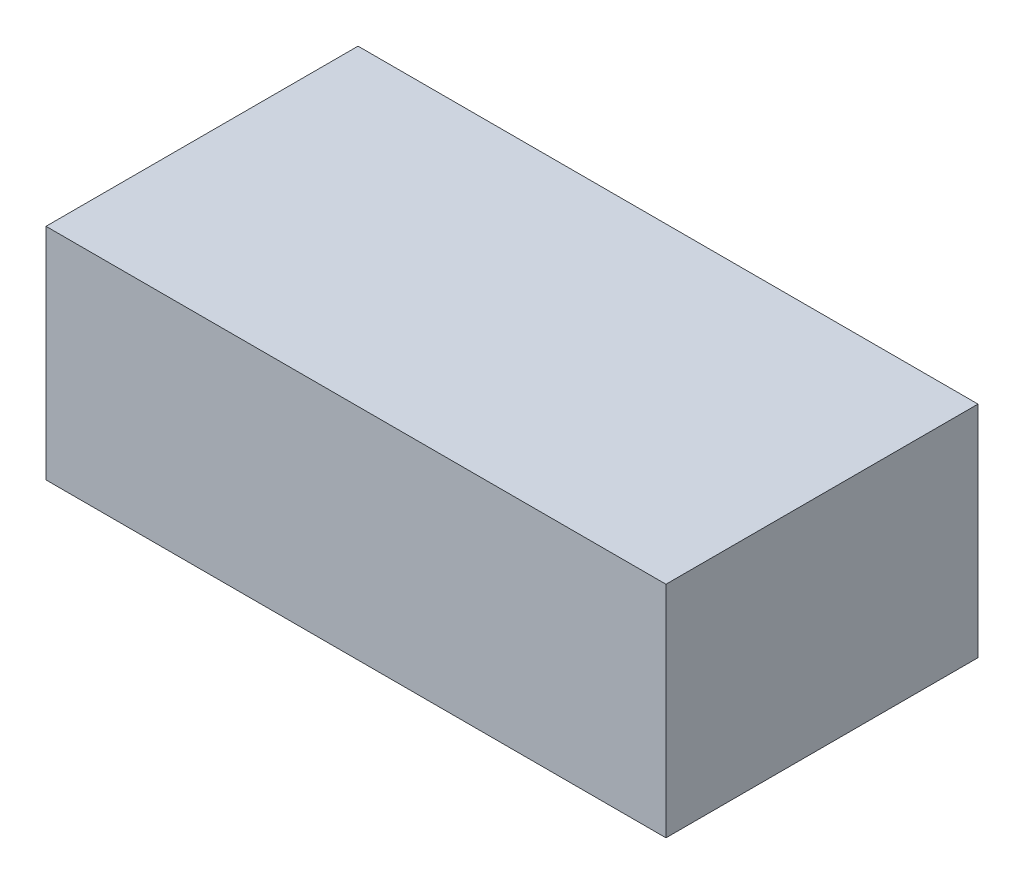
ISO-10303-21;
HEADER;
FILE_DESCRIPTION(('STEP AP214'),'2;1');
FILE_NAME('part.step','',(''),(''),'','','');
FILE_SCHEMA(('AUTOMOTIVE_DESIGN { 1 0 10303 214 1 1 1 1 }'));
ENDSEC;
DATA;
#1=APPLICATION_CONTEXT('core data for automotive mechanical design processes');
#2=APPLICATION_PROTOCOL_DEFINITION('international standard','automotive_design',2000,#1);
#3=PRODUCT_CONTEXT('',#1,'mechanical');
#4=PRODUCT('Part','Part','',(#3));
#5=PRODUCT_RELATED_PRODUCT_CATEGORY('part','',(#4));
#6=PRODUCT_DEFINITION_FORMATION('','',#4);
#7=PRODUCT_DEFINITION_CONTEXT('part definition',#1,'design');
#8=PRODUCT_DEFINITION('design','',#6,#7);
#9=PRODUCT_DEFINITION_SHAPE('','',#8);
#10=(LENGTH_UNIT() NAMED_UNIT(*) SI_UNIT(.MILLI.,.METRE.));
#11=(NAMED_UNIT(*) PLANE_ANGLE_UNIT() SI_UNIT($,.RADIAN.));
#12=(NAMED_UNIT(*) SI_UNIT($,.STERADIAN.) SOLID_ANGLE_UNIT());
#13=UNCERTAINTY_MEASURE_WITH_UNIT(LENGTH_MEASURE(1.E-05),#10,'distance_accuracy_value','');
#14=(GEOMETRIC_REPRESENTATION_CONTEXT(3) GLOBAL_UNCERTAINTY_ASSIGNED_CONTEXT((#13)) GLOBAL_UNIT_ASSIGNED_CONTEXT((#10,
#11,#12)) REPRESENTATION_CONTEXT('',''));
#15=CARTESIAN_POINT('',(0.,0.,0.));
#16=DIRECTION('',(0.,0.,1.));
#17=DIRECTION('',(1.,0.,0.));
#18=AXIS2_PLACEMENT_3D('',#15,#16,#17);
#19=CARTESIAN_POINT('',(-2.7325,0.767249999999999,-0.38));
#20=DIRECTION('',(1.,0.,0.));
#21=DIRECTION('',(0.,0.,1.));
#22=AXIS2_PLACEMENT_3D('',#19,#20,#21);
#23=PLANE('',#22);
#24=DIRECTION('',(0.,0.,-1.));
#25=VECTOR('',#24,1.);
#26=CARTESIAN_POINT('',(-2.7325,0.23225,-0.19));
#27=LINE('',#26,#25);
#28=CARTESIAN_POINT('',(-2.7325,0.23225,0.38));
#29=VERTEX_POINT('',#28);
#30=CARTESIAN_POINT('',(-2.7325,0.23225,-0.38));
#31=VERTEX_POINT('',#30);
#32=EDGE_CURVE('E11',#29,#31,#27,.T.);
#33=ORIENTED_EDGE('',*,*,#32,.F.);
#34=DIRECTION('',(0.,-1.,0.));
#35=VECTOR('',#34,1.);
#36=CARTESIAN_POINT('',(-2.7325,0.767249999999999,0.38));
#37=LINE('',#36,#35);
#38=CARTESIAN_POINT('',(-2.7325,0.767249999999999,0.38));
#39=VERTEX_POINT('',#38);
#40=EDGE_CURVE('E24',#39,#29,#37,.T.);
#41=ORIENTED_EDGE('',*,*,#40,.F.);
#42=DIRECTION('',(0.,0.,1.));
#43=VECTOR('',#42,1.);
#44=CARTESIAN_POINT('',(-2.7325,0.767249999999999,-0.19));
#45=LINE('',#44,#43);
#46=CARTESIAN_POINT('',(-2.7325,0.767249999999999,-0.38));
#47=VERTEX_POINT('',#46);
#48=EDGE_CURVE('E69',#47,#39,#45,.T.);
#49=ORIENTED_EDGE('',*,*,#48,.F.);
#50=DIRECTION('',(0.,-1.,0.));
#51=VECTOR('',#50,1.);
#52=CARTESIAN_POINT('',(-2.7325,0.767249999999999,-0.38));
#53=LINE('',#52,#51);
#54=EDGE_CURVE('E85',#47,#31,#53,.T.);
#55=ORIENTED_EDGE('',*,*,#54,.T.);
#56=EDGE_LOOP('',(#33,#41,#49,#55));
#57=FACE_BOUND('',#56,.T.);
#58=ADVANCED_FACE('F17',(#57),#23,.F.);
#59=CARTESIAN_POINT('',(-1.2225,0.767249999999999,-0.38));
#60=DIRECTION('',(0.,0.,1.));
#61=DIRECTION('',(-1.,0.,0.));
#62=AXIS2_PLACEMENT_3D('',#59,#60,#61);
#63=PLANE('',#62);
#64=DIRECTION('',(1.,0.,0.));
#65=VECTOR('',#64,1.);
#66=CARTESIAN_POINT('',(-1.7225,0.23225,-0.38));
#67=LINE('',#66,#65);
#68=CARTESIAN_POINT('',(-1.2225,0.23225,-0.38));
#69=VERTEX_POINT('',#68);
#70=EDGE_CURVE('E83',#31,#69,#67,.T.);
#71=ORIENTED_EDGE('',*,*,#70,.F.);
#72=ORIENTED_EDGE('',*,*,#54,.F.);
#73=DIRECTION('',(-1.,0.,0.));
#74=VECTOR('',#73,1.);
#75=CARTESIAN_POINT('',(-2.27125,0.767249999999999,-0.38));
#76=LINE('',#75,#74);
#77=CARTESIAN_POINT('',(-1.2225,0.767249999999999,-0.38));
#78=VERTEX_POINT('',#77);
#79=EDGE_CURVE('E81',#78,#47,#76,.T.);
#80=ORIENTED_EDGE('',*,*,#79,.F.);
#81=DIRECTION('',(0.,1.,0.));
#82=VECTOR('',#81,1.);
#83=CARTESIAN_POINT('',(-1.2225,0.499749999999999,-0.38));
#84=LINE('',#83,#82);
#85=EDGE_CURVE('E75',#69,#78,#84,.T.);
#86=ORIENTED_EDGE('',*,*,#85,.F.);
#87=EDGE_LOOP('',(#71,#72,#80,#86));
#88=FACE_BOUND('',#87,.T.);
#89=ADVANCED_FACE('F91',(#88),#63,.F.);
#90=CARTESIAN_POINT('',(-4.9525,0.767249999999999,0.38));
#91=DIRECTION('',(0.,0.,-1.));
#92=DIRECTION('',(1.,0.,0.));
#93=AXIS2_PLACEMENT_3D('',#90,#91,#92);
#94=PLANE('',#93);
#95=DIRECTION('',(-1.,0.,0.));
#96=VECTOR('',#95,1.);
#97=CARTESIAN_POINT('',(-3.5875,0.23225,0.38));
#98=LINE('',#97,#96);
#99=CARTESIAN_POINT('',(-1.2225,0.23225,0.38));
#100=VERTEX_POINT('',#99);
#101=EDGE_CURVE('E57',#100,#29,#98,.T.);
#102=ORIENTED_EDGE('',*,*,#101,.F.);
#103=DIRECTION('',(0.,-1.,0.));
#104=VECTOR('',#103,1.);
#105=CARTESIAN_POINT('',(-1.2225,0.499749999999999,0.38));
#106=LINE('',#105,#104);
#107=CARTESIAN_POINT('',(-1.2225,0.767249999999999,0.38));
#108=VERTEX_POINT('',#107);
#109=EDGE_CURVE('E53',#108,#100,#106,.T.);
#110=ORIENTED_EDGE('',*,*,#109,.F.);
#111=DIRECTION('',(1.,0.,0.));
#112=VECTOR('',#111,1.);
#113=CARTESIAN_POINT('',(-4.13625,0.767249999999999,0.38));
#114=LINE('',#113,#112);
#115=EDGE_CURVE('E56',#39,#108,#114,.T.);
#116=ORIENTED_EDGE('',*,*,#115,.F.);
#117=ORIENTED_EDGE('',*,*,#40,.T.);
#118=EDGE_LOOP('',(#102,#110,#116,#117));
#119=FACE_BOUND('',#118,.T.);
#120=ADVANCED_FACE('F55',(#119),#94,.F.);
#121=CARTESIAN_POINT('',(-2.2225,0.23225,0.));
#122=DIRECTION('',(0.,-1.,0.));
#123=DIRECTION('',(1.,0.,0.));
#124=AXIS2_PLACEMENT_3D('',#121,#122,#123);
#125=PLANE('',#124);
#126=ORIENTED_EDGE('',*,*,#101,.T.);
#127=ORIENTED_EDGE('',*,*,#32,.T.);
#128=ORIENTED_EDGE('',*,*,#70,.T.);
#129=DIRECTION('',(0.,0.,1.));
#130=VECTOR('',#129,1.);
#131=CARTESIAN_POINT('',(-1.2225,0.23225,0.));
#132=LINE('',#131,#130);
#133=EDGE_CURVE('E70',#69,#100,#132,.T.);
#134=ORIENTED_EDGE('',*,*,#133,.T.);
#135=EDGE_LOOP('',(#126,#127,#128,#134));
#136=FACE_BOUND('',#135,.T.);
#137=ADVANCED_FACE('F87',(#136),#125,.T.);
#138=CARTESIAN_POINT('',(-1.2225,0.23225,0.));
#139=DIRECTION('',(1.,0.,0.));
#140=DIRECTION('',(0.,1.,0.));
#141=AXIS2_PLACEMENT_3D('',#138,#139,#140);
#142=PLANE('',#141);
#143=ORIENTED_EDGE('',*,*,#109,.T.);
#144=ORIENTED_EDGE('',*,*,#133,.F.);
#145=ORIENTED_EDGE('',*,*,#85,.T.);
#146=DIRECTION('',(0.,0.,1.));
#147=VECTOR('',#146,1.);
#148=CARTESIAN_POINT('',(-1.2225,0.76725,0.));
#149=LINE('',#148,#147);
#150=EDGE_CURVE('E68',#78,#108,#149,.T.);
#151=ORIENTED_EDGE('',*,*,#150,.T.);
#152=EDGE_LOOP('',(#143,#144,#145,#151));
#153=FACE_BOUND('',#152,.T.);
#154=ADVANCED_FACE('F73',(#153),#142,.T.);
#155=CARTESIAN_POINT('',(-3.32,0.767249999999999,0.));
#156=DIRECTION('',(0.,1.,0.));
#157=DIRECTION('',(-1.,0.,0.));
#158=AXIS2_PLACEMENT_3D('',#155,#156,#157);
#159=PLANE('',#158);
#160=ORIENTED_EDGE('',*,*,#115,.T.);
#161=ORIENTED_EDGE('',*,*,#150,.F.);
#162=ORIENTED_EDGE('',*,*,#79,.T.);
#163=ORIENTED_EDGE('',*,*,#48,.T.);
#164=EDGE_LOOP('',(#160,#161,#162,#163));
#165=FACE_BOUND('',#164,.T.);
#166=ADVANCED_FACE('F66',(#165),#159,.T.);
#167=CLOSED_SHELL('',(#58,#89,#120,#137,#154,#166));
#168=MANIFOLD_SOLID_BREP('B1',#167);
#169=ADVANCED_BREP_SHAPE_REPRESENTATION('',(#18,#168),#14);
#170=SHAPE_DEFINITION_REPRESENTATION(#9,#169);
ENDSEC;
END-ISO-10303-21;
